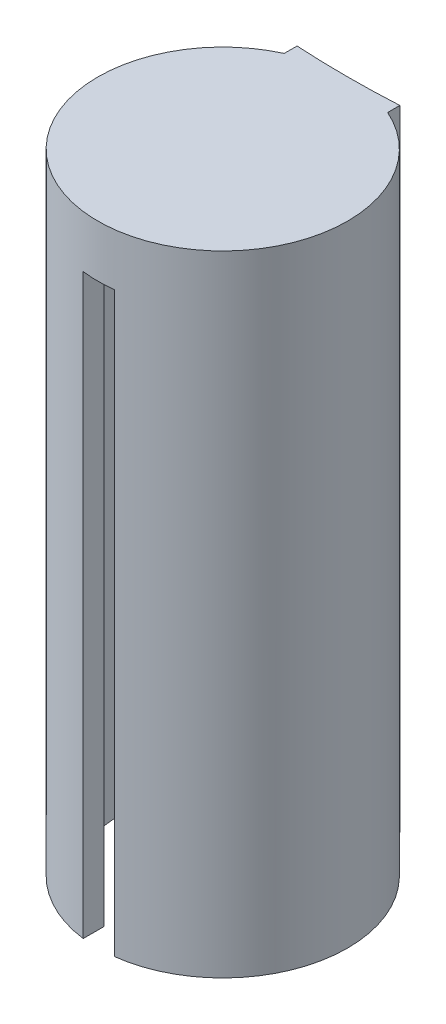
ISO-10303-21;
HEADER;
FILE_DESCRIPTION(('STEP AP214'),'2;1');
FILE_NAME('part.step','',(''),(''),'','','');
FILE_SCHEMA(('AUTOMOTIVE_DESIGN { 1 0 10303 214 1 1 1 1 }'));
ENDSEC;
DATA;
#1=APPLICATION_CONTEXT('core data for automotive mechanical design processes');
#2=APPLICATION_PROTOCOL_DEFINITION('international standard','automotive_design',2000,#1);
#3=PRODUCT_CONTEXT('',#1,'mechanical');
#4=PRODUCT('Part','Part','',(#3));
#5=PRODUCT_RELATED_PRODUCT_CATEGORY('part','',(#4));
#6=PRODUCT_DEFINITION_FORMATION('','',#4);
#7=PRODUCT_DEFINITION_CONTEXT('part definition',#1,'design');
#8=PRODUCT_DEFINITION('design','',#6,#7);
#9=PRODUCT_DEFINITION_SHAPE('','',#8);
#10=(LENGTH_UNIT() NAMED_UNIT(*) SI_UNIT(.MILLI.,.METRE.));
#11=(NAMED_UNIT(*) PLANE_ANGLE_UNIT() SI_UNIT($,.RADIAN.));
#12=(NAMED_UNIT(*) SI_UNIT($,.STERADIAN.) SOLID_ANGLE_UNIT());
#13=UNCERTAINTY_MEASURE_WITH_UNIT(LENGTH_MEASURE(1.E-05),#10,'distance_accuracy_value','');
#14=(GEOMETRIC_REPRESENTATION_CONTEXT(3) GLOBAL_UNCERTAINTY_ASSIGNED_CONTEXT((#13)) GLOBAL_UNIT_ASSIGNED_CONTEXT((#10,
#11,#12)) REPRESENTATION_CONTEXT('',''));
#15=CARTESIAN_POINT('',(0.,0.,0.));
#16=DIRECTION('',(0.,0.,1.));
#17=DIRECTION('',(1.,0.,0.));
#18=AXIS2_PLACEMENT_3D('',#15,#16,#17);
#19=CARTESIAN_POINT('',(0.,1110.,0.));
#20=DIRECTION('',(0.,-1.,0.));
#21=DIRECTION('',(0.,0.,-1.));
#22=AXIS2_PLACEMENT_3D('',#19,#20,#21);
#23=CYLINDRICAL_SURFACE('',#22,240.);
#24=DIRECTION('',(0.,1.,0.));
#25=VECTOR('',#24,1.);
#26=CARTESIAN_POINT('',(97.6793348181246,0.,-219.223054329349));
#27=LINE('',#26,#25);
#28=CARTESIAN_POINT('',(97.6793348181246,0.,-219.223054329349));
#29=VERTEX_POINT('',#28);
#30=CARTESIAN_POINT('',(97.6793348181246,1210.,-219.223054329349));
#31=VERTEX_POINT('',#30);
#32=EDGE_CURVE('E78',#29,#31,#27,.T.);
#33=ORIENTED_EDGE('',*,*,#32,.T.);
#34=CARTESIAN_POINT('',(0.,1210.,0.));
#35=DIRECTION('',(0.,1.,0.));
#36=DIRECTION('',(0.,0.,1.));
#37=AXIS2_PLACEMENT_3D('',#34,#35,#36);
#38=CIRCLE('',#37,240.);
#39=CARTESIAN_POINT('',(-99.9999999999998,1210.,-218.174242292714));
#40=VERTEX_POINT('',#39);
#41=EDGE_CURVE('E165',#40,#31,#38,.T.);
#42=ORIENTED_EDGE('',*,*,#41,.F.);
#43=DIRECTION('',(0.,1.,0.));
#44=VECTOR('',#43,1.);
#45=CARTESIAN_POINT('',(-99.9999999999998,0.,-218.174242292714));
#46=LINE('',#45,#44);
#47=CARTESIAN_POINT('',(-99.9999999999998,0.,-218.174242292714));
#48=VERTEX_POINT('',#47);
#49=EDGE_CURVE('E186',#48,#40,#46,.T.);
#50=ORIENTED_EDGE('',*,*,#49,.F.);
#51=CARTESIAN_POINT('',(0.,0.,0.));
#52=DIRECTION('',(0.,1.,0.));
#53=DIRECTION('',(0.,0.,1.));
#54=AXIS2_PLACEMENT_3D('',#51,#52,#53);
#55=CIRCLE('',#54,240.);
#56=CARTESIAN_POINT('',(-30.,0.,238.117617995813));
#57=VERTEX_POINT('',#56);
#58=EDGE_CURVE('E241',#48,#57,#55,.T.);
#59=ORIENTED_EDGE('',*,*,#58,.T.);
#60=DIRECTION('',(0.,-1.,0.));
#61=VECTOR('',#60,1.);
#62=CARTESIAN_POINT('',(-30.,1110.,238.117617995813));
#63=LINE('',#62,#61);
#64=CARTESIAN_POINT('',(-30.,1110.,238.117617995813));
#65=VERTEX_POINT('',#64);
#66=EDGE_CURVE('E263',#65,#57,#63,.T.);
#67=ORIENTED_EDGE('',*,*,#66,.F.);
#68=CARTESIAN_POINT('',(0.,1110.,0.));
#69=DIRECTION('',(0.,1.,0.));
#70=DIRECTION('',(0.,0.,1.));
#71=AXIS2_PLACEMENT_3D('',#68,#69,#70);
#72=CIRCLE('',#71,240.);
#73=CARTESIAN_POINT('',(30.,1110.,238.117617995813));
#74=VERTEX_POINT('',#73);
#75=EDGE_CURVE('E190',#65,#74,#72,.T.);
#76=ORIENTED_EDGE('',*,*,#75,.T.);
#77=DIRECTION('',(0.,-1.,0.));
#78=VECTOR('',#77,1.);
#79=CARTESIAN_POINT('',(30.,1110.,238.117617995813));
#80=LINE('',#79,#78);
#81=CARTESIAN_POINT('',(30.,0.,238.117617995813));
#82=VERTEX_POINT('',#81);
#83=EDGE_CURVE('E267',#74,#82,#80,.T.);
#84=ORIENTED_EDGE('',*,*,#83,.T.);
#85=EDGE_CURVE('E73',#82,#29,#55,.T.);
#86=ORIENTED_EDGE('',*,*,#85,.T.);
#87=EDGE_LOOP('',(#33,#42,#50,#59,#67,#76,#84,#86));
#88=FACE_BOUND('',#87,.T.);
#89=ADVANCED_FACE('F57',(#88),#23,.T.);
#90=CARTESIAN_POINT('',(-30.,1110.,-220.));
#91=DIRECTION('',(0.,0.,-1.));
#92=DIRECTION('',(-1.,0.,0.));
#93=AXIS2_PLACEMENT_3D('',#90,#91,#92);
#94=PLANE('',#93);
#95=DIRECTION('',(1.,0.,0.));
#96=VECTOR('',#95,1.);
#97=CARTESIAN_POINT('',(-30.,0.,-220.));
#98=LINE('',#97,#96);
#99=CARTESIAN_POINT('',(-30.,0.,-220.));
#100=VERTEX_POINT('',#99);
#101=CARTESIAN_POINT('',(30.,0.,-220.));
#102=VERTEX_POINT('',#101);
#103=EDGE_CURVE('E195',#100,#102,#98,.T.);
#104=ORIENTED_EDGE('',*,*,#103,.T.);
#105=DIRECTION('',(0.,-1.,0.));
#106=VECTOR('',#105,1.);
#107=CARTESIAN_POINT('',(30.,1110.,-220.));
#108=LINE('',#107,#106);
#109=CARTESIAN_POINT('',(30.,1110.,-220.));
#110=VERTEX_POINT('',#109);
#111=EDGE_CURVE('E12',#110,#102,#108,.T.);
#112=ORIENTED_EDGE('',*,*,#111,.F.);
#113=DIRECTION('',(1.,0.,0.));
#114=VECTOR('',#113,1.);
#115=CARTESIAN_POINT('',(-30.,1110.,-220.));
#116=LINE('',#115,#114);
#117=CARTESIAN_POINT('',(-30.,1110.,-220.));
#118=VERTEX_POINT('',#117);
#119=EDGE_CURVE('E199',#118,#110,#116,.T.);
#120=ORIENTED_EDGE('',*,*,#119,.F.);
#121=DIRECTION('',(0.,-1.,0.));
#122=VECTOR('',#121,1.);
#123=CARTESIAN_POINT('',(-30.,1110.,-220.));
#124=LINE('',#123,#122);
#125=EDGE_CURVE('E228',#118,#100,#124,.T.);
#126=ORIENTED_EDGE('',*,*,#125,.T.);
#127=EDGE_LOOP('',(#104,#112,#120,#126));
#128=FACE_BOUND('',#127,.T.);
#129=ADVANCED_FACE('F59',(#128),#94,.F.);
#130=CARTESIAN_POINT('',(30.,1110.,-220.));
#131=DIRECTION('',(1.,0.,0.));
#132=DIRECTION('',(0.,0.,-1.));
#133=AXIS2_PLACEMENT_3D('',#130,#131,#132);
#134=PLANE('',#133);
#135=DIRECTION('',(0.,0.,1.));
#136=VECTOR('',#135,1.);
#137=CARTESIAN_POINT('',(30.,0.,-220.));
#138=LINE('',#137,#136);
#139=CARTESIAN_POINT('',(30.,0.,-197.737199332852));
#140=VERTEX_POINT('',#139);
#141=EDGE_CURVE('E232',#102,#140,#138,.T.);
#142=ORIENTED_EDGE('',*,*,#141,.T.);
#143=DIRECTION('',(0.,-1.,0.));
#144=VECTOR('',#143,1.);
#145=CARTESIAN_POINT('',(30.,1110.,-197.737199332852));
#146=LINE('',#145,#144);
#147=CARTESIAN_POINT('',(30.,1110.,-197.737199332852));
#148=VERTEX_POINT('',#147);
#149=EDGE_CURVE('E66',#148,#140,#146,.T.);
#150=ORIENTED_EDGE('',*,*,#149,.F.);
#151=DIRECTION('',(0.,0.,1.));
#152=VECTOR('',#151,1.);
#153=CARTESIAN_POINT('',(30.,1110.,-220.));
#154=LINE('',#153,#152);
#155=EDGE_CURVE('E203',#110,#148,#154,.T.);
#156=ORIENTED_EDGE('',*,*,#155,.F.);
#157=ORIENTED_EDGE('',*,*,#111,.T.);
#158=EDGE_LOOP('',(#142,#150,#156,#157));
#159=FACE_BOUND('',#158,.T.);
#160=ADVANCED_FACE('F292',(#159),#134,.F.);
#161=CARTESIAN_POINT('',(0.,1110.,0.));
#162=DIRECTION('',(0.,-1.,0.));
#163=DIRECTION('',(0.,0.,-1.));
#164=AXIS2_PLACEMENT_3D('',#161,#162,#163);
#165=CYLINDRICAL_SURFACE('',#164,200.);
#166=CARTESIAN_POINT('',(0.,0.,0.));
#167=DIRECTION('',(0.,-1.,0.));
#168=DIRECTION('',(0.,0.,1.));
#169=AXIS2_PLACEMENT_3D('',#166,#167,#168);
#170=CIRCLE('',#169,200.);
#171=CARTESIAN_POINT('',(30.,0.,197.737199332852));
#172=VERTEX_POINT('',#171);
#173=EDGE_CURVE('E235',#140,#172,#170,.T.);
#174=ORIENTED_EDGE('',*,*,#173,.T.);
#175=DIRECTION('',(0.,-1.,0.));
#176=VECTOR('',#175,1.);
#177=CARTESIAN_POINT('',(30.,1110.,197.737199332852));
#178=LINE('',#177,#176);
#179=CARTESIAN_POINT('',(30.,1110.,197.737199332852));
#180=VERTEX_POINT('',#179);
#181=EDGE_CURVE('E270',#180,#172,#178,.T.);
#182=ORIENTED_EDGE('',*,*,#181,.F.);
#183=CARTESIAN_POINT('',(0.,1110.,0.));
#184=DIRECTION('',(0.,-1.,0.));
#185=DIRECTION('',(0.,0.,1.));
#186=AXIS2_PLACEMENT_3D('',#183,#184,#185);
#187=CIRCLE('',#186,200.);
#188=EDGE_CURVE('E208',#148,#180,#187,.T.);
#189=ORIENTED_EDGE('',*,*,#188,.F.);
#190=ORIENTED_EDGE('',*,*,#149,.T.);
#191=EDGE_LOOP('',(#174,#182,#189,#190));
#192=FACE_BOUND('',#191,.T.);
#193=ADVANCED_FACE('F278',(#192),#165,.F.);
#194=CARTESIAN_POINT('',(30.,1110.,238.117617995813));
#195=DIRECTION('',(1.,0.,0.));
#196=DIRECTION('',(0.,0.,-1.));
#197=AXIS2_PLACEMENT_3D('',#194,#195,#196);
#198=PLANE('',#197);
#199=DIRECTION('',(0.,0.,1.));
#200=VECTOR('',#199,1.);
#201=CARTESIAN_POINT('',(30.,0.,238.117617995813));
#202=LINE('',#201,#200);
#203=EDGE_CURVE('E238',#172,#82,#202,.T.);
#204=ORIENTED_EDGE('',*,*,#203,.T.);
#205=ORIENTED_EDGE('',*,*,#83,.F.);
#206=DIRECTION('',(0.,0.,1.));
#207=VECTOR('',#206,1.);
#208=CARTESIAN_POINT('',(30.,1110.,238.117617995813));
#209=LINE('',#208,#207);
#210=EDGE_CURVE('E212',#180,#74,#209,.T.);
#211=ORIENTED_EDGE('',*,*,#210,.F.);
#212=ORIENTED_EDGE('',*,*,#181,.T.);
#213=EDGE_LOOP('',(#204,#205,#211,#212));
#214=FACE_BOUND('',#213,.T.);
#215=ADVANCED_FACE('F285',(#214),#198,.F.);
#216=CARTESIAN_POINT('',(-30.,1110.,197.737199332852));
#217=DIRECTION('',(-1.,0.,0.));
#218=DIRECTION('',(0.,0.,1.));
#219=AXIS2_PLACEMENT_3D('',#216,#217,#218);
#220=PLANE('',#219);
#221=DIRECTION('',(0.,0.,-1.));
#222=VECTOR('',#221,1.);
#223=CARTESIAN_POINT('',(-30.,0.,197.737199332852));
#224=LINE('',#223,#222);
#225=CARTESIAN_POINT('',(-30.0000000000001,0.,197.737199332852));
#226=VERTEX_POINT('',#225);
#227=EDGE_CURVE('E244',#57,#226,#224,.T.);
#228=ORIENTED_EDGE('',*,*,#227,.T.);
#229=DIRECTION('',(0.,-1.,0.));
#230=VECTOR('',#229,1.);
#231=CARTESIAN_POINT('',(-30.0000000000001,1110.,197.737199332852));
#232=LINE('',#231,#230);
#233=CARTESIAN_POINT('',(-30.0000000000001,1110.,197.737199332852));
#234=VERTEX_POINT('',#233);
#235=EDGE_CURVE('E259',#234,#226,#232,.T.);
#236=ORIENTED_EDGE('',*,*,#235,.F.);
#237=DIRECTION('',(0.,0.,-1.));
#238=VECTOR('',#237,1.);
#239=CARTESIAN_POINT('',(-30.,1110.,197.737199332852));
#240=LINE('',#239,#238);
#241=EDGE_CURVE('E216',#65,#234,#240,.T.);
#242=ORIENTED_EDGE('',*,*,#241,.F.);
#243=ORIENTED_EDGE('',*,*,#66,.T.);
#244=EDGE_LOOP('',(#228,#236,#242,#243));
#245=FACE_BOUND('',#244,.T.);
#246=ADVANCED_FACE('F305',(#245),#220,.F.);
#247=CARTESIAN_POINT('',(0.,1110.,0.));
#248=DIRECTION('',(0.,-1.,0.));
#249=DIRECTION('',(0.,0.,-1.));
#250=AXIS2_PLACEMENT_3D('',#247,#248,#249);
#251=CYLINDRICAL_SURFACE('',#250,200.);
#252=CARTESIAN_POINT('',(0.,0.,0.));
#253=DIRECTION('',(0.,-1.,0.));
#254=DIRECTION('',(0.,0.,1.));
#255=AXIS2_PLACEMENT_3D('',#252,#253,#254);
#256=CIRCLE('',#255,200.);
#257=CARTESIAN_POINT('',(-30.,0.,-197.737199332852));
#258=VERTEX_POINT('',#257);
#259=EDGE_CURVE('E247',#226,#258,#256,.T.);
#260=ORIENTED_EDGE('',*,*,#259,.T.);
#261=DIRECTION('',(0.,-1.,0.));
#262=VECTOR('',#261,1.);
#263=CARTESIAN_POINT('',(-30.,1110.,-197.737199332852));
#264=LINE('',#263,#262);
#265=CARTESIAN_POINT('',(-30.,1110.,-197.737199332852));
#266=VERTEX_POINT('',#265);
#267=EDGE_CURVE('E255',#266,#258,#264,.T.);
#268=ORIENTED_EDGE('',*,*,#267,.F.);
#269=CARTESIAN_POINT('',(0.,1110.,0.));
#270=DIRECTION('',(0.,-1.,0.));
#271=DIRECTION('',(0.,0.,1.));
#272=AXIS2_PLACEMENT_3D('',#269,#270,#271);
#273=CIRCLE('',#272,200.);
#274=EDGE_CURVE('E220',#234,#266,#273,.T.);
#275=ORIENTED_EDGE('',*,*,#274,.F.);
#276=ORIENTED_EDGE('',*,*,#235,.T.);
#277=EDGE_LOOP('',(#260,#268,#275,#276));
#278=FACE_BOUND('',#277,.T.);
#279=ADVANCED_FACE('F303',(#278),#251,.F.);
#280=CARTESIAN_POINT('',(-30.,1110.,-197.737199332852));
#281=DIRECTION('',(-1.,0.,0.));
#282=DIRECTION('',(0.,0.,1.));
#283=AXIS2_PLACEMENT_3D('',#280,#281,#282);
#284=PLANE('',#283);
#285=DIRECTION('',(0.,0.,-1.));
#286=VECTOR('',#285,1.);
#287=CARTESIAN_POINT('',(-30.,0.,-197.737199332852));
#288=LINE('',#287,#286);
#289=EDGE_CURVE('E204',#258,#100,#288,.T.);
#290=ORIENTED_EDGE('',*,*,#289,.T.);
#291=ORIENTED_EDGE('',*,*,#125,.F.);
#292=DIRECTION('',(0.,0.,-1.));
#293=VECTOR('',#292,1.);
#294=CARTESIAN_POINT('',(-30.,1110.,-197.737199332852));
#295=LINE('',#294,#293);
#296=EDGE_CURVE('E224',#266,#118,#295,.T.);
#297=ORIENTED_EDGE('',*,*,#296,.F.);
#298=ORIENTED_EDGE('',*,*,#267,.T.);
#299=EDGE_LOOP('',(#290,#291,#297,#298));
#300=FACE_BOUND('',#299,.T.);
#301=ADVANCED_FACE('F299',(#300),#284,.F.);
#302=CARTESIAN_POINT('',(0.,0.,0.));
#303=DIRECTION('',(0.,1.,0.));
#304=DIRECTION('',(0.,0.,1.));
#305=AXIS2_PLACEMENT_3D('',#302,#303,#304);
#306=PLANE('',#305);
#307=ORIENTED_EDGE('',*,*,#103,.F.);
#308=ORIENTED_EDGE('',*,*,#289,.F.);
#309=ORIENTED_EDGE('',*,*,#259,.F.);
#310=ORIENTED_EDGE('',*,*,#227,.F.);
#311=ORIENTED_EDGE('',*,*,#58,.F.);
#312=DIRECTION('',(0.,0.,-1.));
#313=VECTOR('',#312,1.);
#314=CARTESIAN_POINT('',(-99.9999999999998,0.,0.));
#315=LINE('',#314,#313);
#316=CARTESIAN_POINT('',(-99.9999999999998,0.,-242.859479034385));
#317=VERTEX_POINT('',#316);
#318=EDGE_CURVE('E181',#48,#317,#315,.T.);
#319=ORIENTED_EDGE('',*,*,#318,.T.);
#320=CARTESIAN_POINT('',(0.,0.,-1990.));
#321=DIRECTION('',(0.,1.,0.));
#322=DIRECTION('',(0.,0.,1.));
#323=AXIS2_PLACEMENT_3D('',#320,#321,#322);
#324=CIRCLE('',#323,1750.);
#325=CARTESIAN_POINT('',(97.6793348181246,0.,-242.728198719647));
#326=VERTEX_POINT('',#325);
#327=EDGE_CURVE('E178',#317,#326,#324,.T.);
#328=ORIENTED_EDGE('',*,*,#327,.T.);
#329=DIRECTION('',(0.,0.,1.));
#330=VECTOR('',#329,1.);
#331=CARTESIAN_POINT('',(97.6793348181246,0.,0.));
#332=LINE('',#331,#330);
#333=EDGE_CURVE('E160',#326,#29,#332,.T.);
#334=ORIENTED_EDGE('',*,*,#333,.T.);
#335=ORIENTED_EDGE('',*,*,#85,.F.);
#336=ORIENTED_EDGE('',*,*,#203,.F.);
#337=ORIENTED_EDGE('',*,*,#173,.F.);
#338=ORIENTED_EDGE('',*,*,#141,.F.);
#339=EDGE_LOOP('',(#307,#308,#309,#310,#311,#319,#328,#334,#335,#336,#337,#338));
#340=FACE_BOUND('',#339,.T.);
#341=ADVANCED_FACE('F283',(#340),#306,.F.);
#342=CARTESIAN_POINT('',(0.,1110.,0.));
#343=DIRECTION('',(0.,1.,0.));
#344=DIRECTION('',(0.,0.,1.));
#345=AXIS2_PLACEMENT_3D('',#342,#343,#344);
#346=PLANE('',#345);
#347=ORIENTED_EDGE('',*,*,#188,.T.);
#348=ORIENTED_EDGE('',*,*,#210,.T.);
#349=ORIENTED_EDGE('',*,*,#75,.F.);
#350=ORIENTED_EDGE('',*,*,#241,.T.);
#351=ORIENTED_EDGE('',*,*,#274,.T.);
#352=ORIENTED_EDGE('',*,*,#296,.T.);
#353=ORIENTED_EDGE('',*,*,#119,.T.);
#354=ORIENTED_EDGE('',*,*,#155,.T.);
#355=EDGE_LOOP('',(#347,#348,#349,#350,#351,#352,#353,#354));
#356=FACE_BOUND('',#355,.T.);
#357=ADVANCED_FACE('F290',(#356),#346,.F.);
#358=CARTESIAN_POINT('',(0.,1210.,0.));
#359=DIRECTION('',(0.,1.,0.));
#360=DIRECTION('',(0.,0.,1.));
#361=AXIS2_PLACEMENT_3D('',#358,#359,#360);
#362=PLANE('',#361);
#363=ORIENTED_EDGE('',*,*,#41,.T.);
#364=DIRECTION('',(0.,0.,1.));
#365=VECTOR('',#364,1.);
#366=CARTESIAN_POINT('',(97.6793348181246,1210.,0.));
#367=LINE('',#366,#365);
#368=CARTESIAN_POINT('',(97.6793348181246,1210.,-242.728198719647));
#369=VERTEX_POINT('',#368);
#370=EDGE_CURVE('E163',#369,#31,#367,.T.);
#371=ORIENTED_EDGE('',*,*,#370,.F.);
#372=CARTESIAN_POINT('',(0.,1210.,-1990.));
#373=DIRECTION('',(0.,1.,0.));
#374=DIRECTION('',(0.,0.,1.));
#375=AXIS2_PLACEMENT_3D('',#372,#373,#374);
#376=CIRCLE('',#375,1750.);
#377=CARTESIAN_POINT('',(-99.9999999999998,1210.,-242.859479034385));
#378=VERTEX_POINT('',#377);
#379=EDGE_CURVE('E149',#378,#369,#376,.T.);
#380=ORIENTED_EDGE('',*,*,#379,.F.);
#381=DIRECTION('',(0.,0.,-1.));
#382=VECTOR('',#381,1.);
#383=CARTESIAN_POINT('',(-99.9999999999998,1210.,0.));
#384=LINE('',#383,#382);
#385=EDGE_CURVE('E159',#40,#378,#384,.T.);
#386=ORIENTED_EDGE('',*,*,#385,.F.);
#387=EDGE_LOOP('',(#363,#371,#380,#386));
#388=FACE_BOUND('',#387,.T.);
#389=ADVANCED_FACE('F164',(#388),#362,.T.);
#390=CARTESIAN_POINT('',(0.,0.,-1990.));
#391=DIRECTION('',(0.,1.,0.));
#392=DIRECTION('',(0.,0.,1.));
#393=AXIS2_PLACEMENT_3D('',#390,#391,#392);
#394=CYLINDRICAL_SURFACE('',#393,1750.);
#395=ORIENTED_EDGE('',*,*,#379,.T.);
#396=DIRECTION('',(0.,1.,0.));
#397=VECTOR('',#396,1.);
#398=CARTESIAN_POINT('',(97.6793348181246,0.,-242.728198719647));
#399=LINE('',#398,#397);
#400=EDGE_CURVE('E154',#326,#369,#399,.T.);
#401=ORIENTED_EDGE('',*,*,#400,.F.);
#402=ORIENTED_EDGE('',*,*,#327,.F.);
#403=DIRECTION('',(0.,1.,0.));
#404=VECTOR('',#403,1.);
#405=CARTESIAN_POINT('',(-99.9999999999998,0.,-242.859479034385));
#406=LINE('',#405,#404);
#407=EDGE_CURVE('E156',#317,#378,#406,.T.);
#408=ORIENTED_EDGE('',*,*,#407,.T.);
#409=EDGE_LOOP('',(#395,#401,#402,#408));
#410=FACE_BOUND('',#409,.T.);
#411=ADVANCED_FACE('F151',(#410),#394,.F.);
#412=CARTESIAN_POINT('',(-99.9999999999998,0.,0.));
#413=DIRECTION('',(1.,0.,0.));
#414=DIRECTION('',(0.,0.,-1.));
#415=AXIS2_PLACEMENT_3D('',#412,#413,#414);
#416=PLANE('',#415);
#417=ORIENTED_EDGE('',*,*,#385,.T.);
#418=ORIENTED_EDGE('',*,*,#407,.F.);
#419=ORIENTED_EDGE('',*,*,#318,.F.);
#420=ORIENTED_EDGE('',*,*,#49,.T.);
#421=EDGE_LOOP('',(#417,#418,#419,#420));
#422=FACE_BOUND('',#421,.T.);
#423=ADVANCED_FACE('F310',(#422),#416,.F.);
#424=CARTESIAN_POINT('',(97.6793348181246,0.,0.));
#425=DIRECTION('',(-1.,0.,0.));
#426=DIRECTION('',(0.,0.,1.));
#427=AXIS2_PLACEMENT_3D('',#424,#425,#426);
#428=PLANE('',#427);
#429=ORIENTED_EDGE('',*,*,#370,.T.);
#430=ORIENTED_EDGE('',*,*,#32,.F.);
#431=ORIENTED_EDGE('',*,*,#333,.F.);
#432=ORIENTED_EDGE('',*,*,#400,.T.);
#433=EDGE_LOOP('',(#429,#430,#431,#432));
#434=FACE_BOUND('',#433,.T.);
#435=ADVANCED_FACE('F170',(#434),#428,.F.);
#436=CLOSED_SHELL('',(#89,#129,#160,#193,#215,#246,#279,#301,#341,#357,#389,#411,#423,#435));
#437=MANIFOLD_SOLID_BREP('B2',#436);
#438=ADVANCED_BREP_SHAPE_REPRESENTATION('',(#18,#437),#14);
#439=SHAPE_DEFINITION_REPRESENTATION(#9,#438);
ENDSEC;
END-ISO-10303-21;
